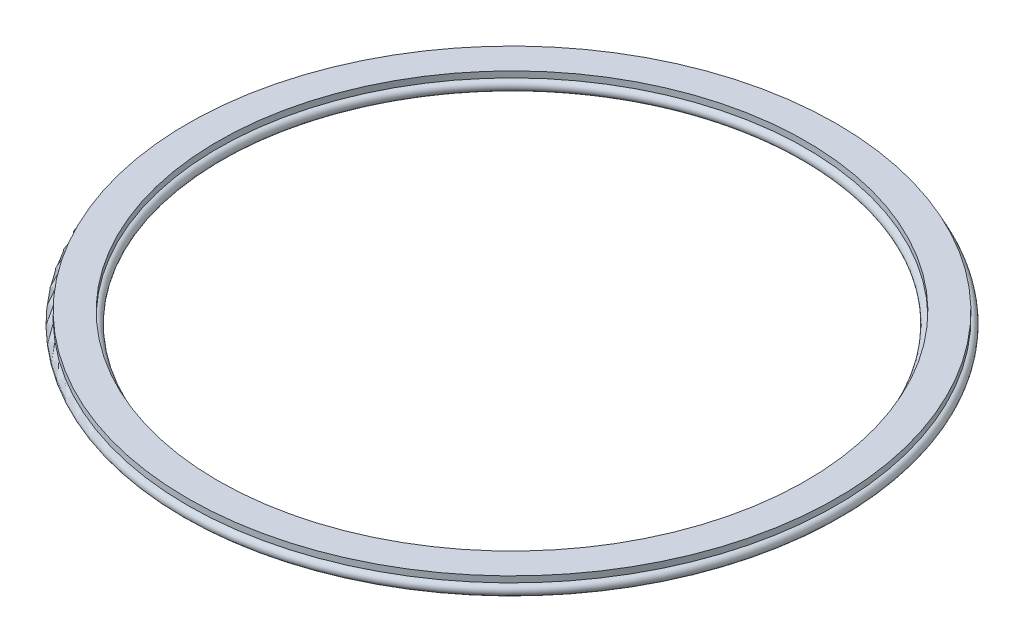
ISO-10303-21;
HEADER;
FILE_DESCRIPTION(('STEP AP214'),'2;1');
FILE_NAME('part.step','',(''),(''),'','','');
FILE_SCHEMA(('AUTOMOTIVE_DESIGN { 1 0 10303 214 1 1 1 1 }'));
ENDSEC;
DATA;
#1=APPLICATION_CONTEXT('core data for automotive mechanical design processes');
#2=APPLICATION_PROTOCOL_DEFINITION('international standard','automotive_design',2000,#1);
#3=PRODUCT_CONTEXT('',#1,'mechanical');
#4=PRODUCT('Part','Part','',(#3));
#5=PRODUCT_RELATED_PRODUCT_CATEGORY('part','',(#4));
#6=PRODUCT_DEFINITION_FORMATION('','',#4);
#7=PRODUCT_DEFINITION_CONTEXT('part definition',#1,'design');
#8=PRODUCT_DEFINITION('design','',#6,#7);
#9=PRODUCT_DEFINITION_SHAPE('','',#8);
#10=(LENGTH_UNIT() NAMED_UNIT(*) SI_UNIT(.MILLI.,.METRE.));
#11=(NAMED_UNIT(*) PLANE_ANGLE_UNIT() SI_UNIT($,.RADIAN.));
#12=(NAMED_UNIT(*) SI_UNIT($,.STERADIAN.) SOLID_ANGLE_UNIT());
#13=UNCERTAINTY_MEASURE_WITH_UNIT(LENGTH_MEASURE(1.E-05),#10,'distance_accuracy_value','');
#14=(GEOMETRIC_REPRESENTATION_CONTEXT(3) GLOBAL_UNCERTAINTY_ASSIGNED_CONTEXT((#13)) GLOBAL_UNIT_ASSIGNED_CONTEXT((#10,
#11,#12)) REPRESENTATION_CONTEXT('',''));
#15=CARTESIAN_POINT('',(0.,0.,0.));
#16=DIRECTION('',(0.,0.,1.));
#17=DIRECTION('',(1.,0.,0.));
#18=AXIS2_PLACEMENT_3D('',#15,#16,#17);
#19=CARTESIAN_POINT('',(0.,0.,0.));
#20=DIRECTION('',(0.,1.,0.));
#21=DIRECTION('',(0.,0.,1.));
#22=AXIS2_PLACEMENT_3D('',#19,#20,#21);
#23=CYLINDRICAL_SURFACE('',#22,320.);
#24=CARTESIAN_POINT('',(0.,0.,0.));
#25=DIRECTION('',(0.,1.,0.));
#26=DIRECTION('',(0.,0.,1.));
#27=AXIS2_PLACEMENT_3D('',#24,#25,#26);
#28=CIRCLE('',#27,320.);
#29=CARTESIAN_POINT('',(0.,0.,320.));
#30=VERTEX_POINT('',#29);
#31=EDGE_CURVE('E10',#30,#30,#28,.T.);
#32=ORIENTED_EDGE('',*,*,#31,.F.);
#33=EDGE_LOOP('',(#32));
#34=FACE_BOUND('',#33,.T.);
#35=CARTESIAN_POINT('',(0.,-6.00000000000001,0.));
#36=DIRECTION('',(0.,1.,0.));
#37=DIRECTION('',(0.,0.,1.));
#38=AXIS2_PLACEMENT_3D('',#35,#36,#37);
#39=CIRCLE('',#38,320.);
#40=CARTESIAN_POINT('',(0.,-6.00000000000001,320.));
#41=VERTEX_POINT('',#40);
#42=EDGE_CURVE('E59',#41,#41,#39,.T.);
#43=ORIENTED_EDGE('',*,*,#42,.T.);
#44=EDGE_LOOP('',(#43));
#45=FACE_BOUND('',#44,.T.);
#46=ADVANCED_FACE('F31',(#34,#45),#23,.T.);
#47=CARTESIAN_POINT('',(320.,0.,0.));
#48=DIRECTION('',(0.,-1.,0.));
#49=DIRECTION('',(0.,0.,-1.));
#50=AXIS2_PLACEMENT_3D('',#47,#48,#49);
#51=PLANE('',#50);
#52=CARTESIAN_POINT('',(0.,0.,0.));
#53=DIRECTION('',(0.,1.,0.));
#54=DIRECTION('',(0.,0.,1.));
#55=AXIS2_PLACEMENT_3D('',#52,#53,#54);
#56=CIRCLE('',#55,290.);
#57=CARTESIAN_POINT('',(0.,0.,290.));
#58=VERTEX_POINT('',#57);
#59=EDGE_CURVE('E37',#58,#58,#56,.T.);
#60=ORIENTED_EDGE('',*,*,#59,.F.);
#61=EDGE_LOOP('',(#60));
#62=FACE_BOUND('',#61,.T.);
#63=ORIENTED_EDGE('',*,*,#31,.T.);
#64=EDGE_LOOP('',(#63));
#65=FACE_BOUND('',#64,.T.);
#66=ADVANCED_FACE('F96',(#62,#65),#51,.F.);
#67=CARTESIAN_POINT('',(0.,0.,0.));
#68=DIRECTION('',(0.,1.,0.));
#69=DIRECTION('',(0.,0.,1.));
#70=AXIS2_PLACEMENT_3D('',#67,#68,#69);
#71=CYLINDRICAL_SURFACE('',#70,290.);
#72=CARTESIAN_POINT('',(0.,-6.00000000000001,0.));
#73=DIRECTION('',(0.,1.,0.));
#74=DIRECTION('',(0.,0.,1.));
#75=AXIS2_PLACEMENT_3D('',#72,#73,#74);
#76=CIRCLE('',#75,290.);
#77=CARTESIAN_POINT('',(0.,-6.00000000000001,290.));
#78=VERTEX_POINT('',#77);
#79=EDGE_CURVE('E41',#78,#78,#76,.T.);
#80=ORIENTED_EDGE('',*,*,#79,.F.);
#81=EDGE_LOOP('',(#80));
#82=FACE_BOUND('',#81,.T.);
#83=ORIENTED_EDGE('',*,*,#59,.T.);
#84=EDGE_LOOP('',(#83));
#85=FACE_BOUND('',#84,.T.);
#86=ADVANCED_FACE('F91',(#82,#85),#71,.F.);
#87=CARTESIAN_POINT('',(0.,-11.,0.));
#88=DIRECTION('',(0.,1.,0.));
#89=DIRECTION('',(0.,0.,1.));
#90=AXIS2_PLACEMENT_3D('',#87,#88,#89);
#91=TOROIDAL_SURFACE('',#90,290.,5.);
#92=CARTESIAN_POINT('',(0.,-11.,0.));
#93=DIRECTION('',(0.,1.,0.));
#94=DIRECTION('',(0.,0.,1.));
#95=AXIS2_PLACEMENT_3D('',#92,#93,#94);
#96=CIRCLE('',#95,295.);
#97=CARTESIAN_POINT('',(0.,-11.,295.));
#98=VERTEX_POINT('',#97);
#99=EDGE_CURVE('E45',#98,#98,#96,.T.);
#100=ORIENTED_EDGE('',*,*,#99,.F.);
#101=EDGE_LOOP('',(#100));
#102=FACE_BOUND('',#101,.T.);
#103=ORIENTED_EDGE('',*,*,#79,.T.);
#104=EDGE_LOOP('',(#103));
#105=FACE_BOUND('',#104,.T.);
#106=ADVANCED_FACE('F85',(#102,#105),#91,.T.);
#107=CARTESIAN_POINT('',(0.,0.,0.));
#108=DIRECTION('',(0.,1.,0.));
#109=DIRECTION('',(0.,0.,1.));
#110=AXIS2_PLACEMENT_3D('',#107,#108,#109);
#111=CYLINDRICAL_SURFACE('',#110,295.);
#112=CARTESIAN_POINT('',(0.,-6.00000000000001,0.));
#113=DIRECTION('',(0.,1.,0.));
#114=DIRECTION('',(0.,0.,1.));
#115=AXIS2_PLACEMENT_3D('',#112,#113,#114);
#116=CIRCLE('',#115,295.);
#117=CARTESIAN_POINT('',(0.,-6.00000000000001,295.));
#118=VERTEX_POINT('',#117);
#119=EDGE_CURVE('E50',#118,#118,#116,.T.);
#120=ORIENTED_EDGE('',*,*,#119,.F.);
#121=EDGE_LOOP('',(#120));
#122=FACE_BOUND('',#121,.T.);
#123=ORIENTED_EDGE('',*,*,#99,.T.);
#124=EDGE_LOOP('',(#123));
#125=FACE_BOUND('',#124,.T.);
#126=ADVANCED_FACE('F79',(#122,#125),#111,.T.);
#127=CARTESIAN_POINT('',(315.,-6.00000000000001,0.));
#128=DIRECTION('',(0.,1.,0.));
#129=DIRECTION('',(0.,0.,1.));
#130=AXIS2_PLACEMENT_3D('',#127,#128,#129);
#131=PLANE('',#130);
#132=CARTESIAN_POINT('',(0.,-6.00000000000001,0.));
#133=DIRECTION('',(0.,1.,0.));
#134=DIRECTION('',(0.,0.,1.));
#135=AXIS2_PLACEMENT_3D('',#132,#133,#134);
#136=CIRCLE('',#135,315.);
#137=CARTESIAN_POINT('',(0.,-6.00000000000001,315.));
#138=VERTEX_POINT('',#137);
#139=EDGE_CURVE('E53',#138,#138,#136,.T.);
#140=ORIENTED_EDGE('',*,*,#139,.F.);
#141=EDGE_LOOP('',(#140));
#142=FACE_BOUND('',#141,.T.);
#143=ORIENTED_EDGE('',*,*,#119,.T.);
#144=EDGE_LOOP('',(#143));
#145=FACE_BOUND('',#144,.T.);
#146=ADVANCED_FACE('F73',(#142,#145),#131,.F.);
#147=CARTESIAN_POINT('',(0.,0.,0.));
#148=DIRECTION('',(0.,1.,0.));
#149=DIRECTION('',(0.,0.,1.));
#150=AXIS2_PLACEMENT_3D('',#147,#148,#149);
#151=CYLINDRICAL_SURFACE('',#150,315.);
#152=CARTESIAN_POINT('',(0.,-11.,0.));
#153=DIRECTION('',(0.,1.,0.));
#154=DIRECTION('',(0.,0.,1.));
#155=AXIS2_PLACEMENT_3D('',#152,#153,#154);
#156=CIRCLE('',#155,315.);
#157=CARTESIAN_POINT('',(0.,-11.,315.));
#158=VERTEX_POINT('',#157);
#159=EDGE_CURVE('E56',#158,#158,#156,.T.);
#160=ORIENTED_EDGE('',*,*,#159,.F.);
#161=EDGE_LOOP('',(#160));
#162=FACE_BOUND('',#161,.T.);
#163=ORIENTED_EDGE('',*,*,#139,.T.);
#164=EDGE_LOOP('',(#163));
#165=FACE_BOUND('',#164,.T.);
#166=ADVANCED_FACE('F67',(#162,#165),#151,.F.);
#167=CARTESIAN_POINT('',(0.,-11.,0.));
#168=DIRECTION('',(0.,1.,0.));
#169=DIRECTION('',(0.,0.,1.));
#170=AXIS2_PLACEMENT_3D('',#167,#168,#169);
#171=TOROIDAL_SURFACE('',#170,320.,5.);
#172=ORIENTED_EDGE('',*,*,#42,.F.);
#173=EDGE_LOOP('',(#172));
#174=FACE_BOUND('',#173,.T.);
#175=ORIENTED_EDGE('',*,*,#159,.T.);
#176=EDGE_LOOP('',(#175));
#177=FACE_BOUND('',#176,.T.);
#178=ADVANCED_FACE('F64',(#174,#177),#171,.T.);
#179=CLOSED_SHELL('',(#46,#66,#86,#106,#126,#146,#166,#178));
#180=MANIFOLD_SOLID_BREP('B2',#179);
#181=ADVANCED_BREP_SHAPE_REPRESENTATION('',(#18,#180),#14);
#182=SHAPE_DEFINITION_REPRESENTATION(#9,#181);
ENDSEC;
END-ISO-10303-21;
